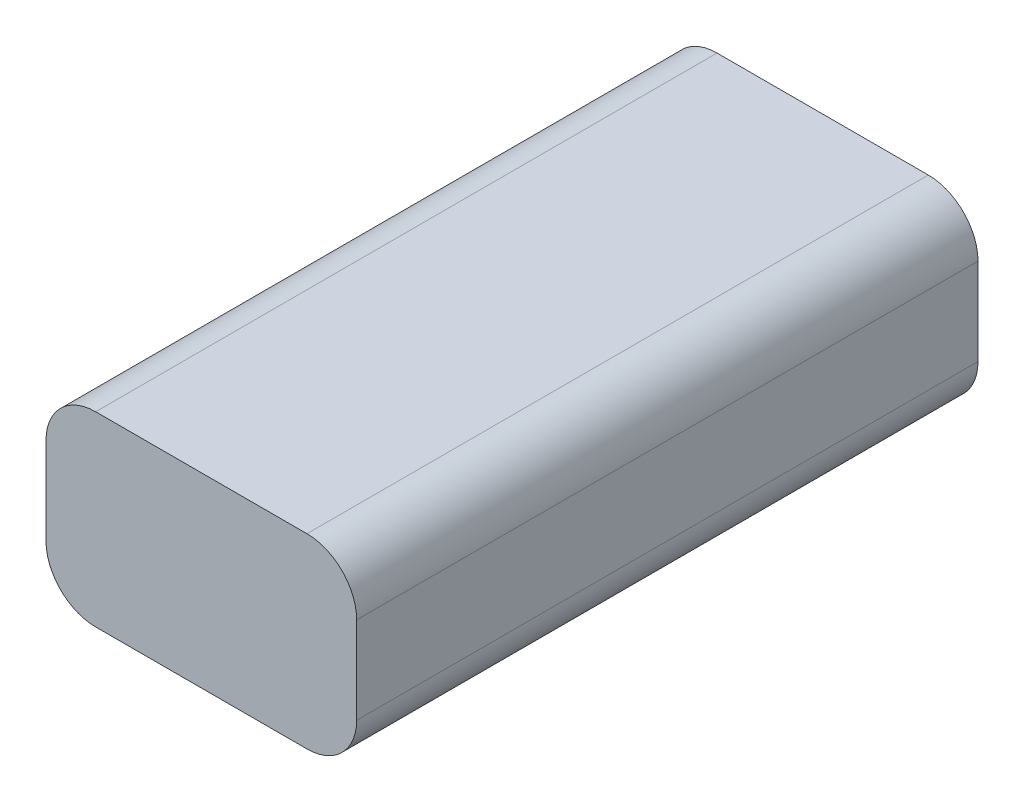
ISO-10303-21;
HEADER;
FILE_DESCRIPTION(('STEP AP214'),'2;1');
FILE_NAME('part.step','',(''),(''),'','','');
FILE_SCHEMA(('AUTOMOTIVE_DESIGN { 1 0 10303 214 1 1 1 1 }'));
ENDSEC;
DATA;
#1=APPLICATION_CONTEXT('core data for automotive mechanical design processes');
#2=APPLICATION_PROTOCOL_DEFINITION('international standard','automotive_design',2000,#1);
#3=PRODUCT_CONTEXT('',#1,'mechanical');
#4=PRODUCT('Part','Part','',(#3));
#5=PRODUCT_RELATED_PRODUCT_CATEGORY('part','',(#4));
#6=PRODUCT_DEFINITION_FORMATION('','',#4);
#7=PRODUCT_DEFINITION_CONTEXT('part definition',#1,'design');
#8=PRODUCT_DEFINITION('design','',#6,#7);
#9=PRODUCT_DEFINITION_SHAPE('','',#8);
#10=(LENGTH_UNIT() NAMED_UNIT(*) SI_UNIT(.MILLI.,.METRE.));
#11=(NAMED_UNIT(*) PLANE_ANGLE_UNIT() SI_UNIT($,.RADIAN.));
#12=(NAMED_UNIT(*) SI_UNIT($,.STERADIAN.) SOLID_ANGLE_UNIT());
#13=UNCERTAINTY_MEASURE_WITH_UNIT(LENGTH_MEASURE(1.E-05),#10,'distance_accuracy_value','');
#14=(GEOMETRIC_REPRESENTATION_CONTEXT(3) GLOBAL_UNCERTAINTY_ASSIGNED_CONTEXT((#13)) GLOBAL_UNIT_ASSIGNED_CONTEXT((#10,
#11,#12)) REPRESENTATION_CONTEXT('',''));
#15=CARTESIAN_POINT('',(0.,0.,0.));
#16=DIRECTION('',(0.,0.,1.));
#17=DIRECTION('',(1.,0.,0.));
#18=AXIS2_PLACEMENT_3D('',#15,#16,#17);
#19=CARTESIAN_POINT('',(25.,30.,-50.));
#20=DIRECTION('',(-1.,0.,0.));
#21=DIRECTION('',(0.,0.,1.));
#22=AXIS2_PLACEMENT_3D('',#19,#20,#21);
#23=PLANE('',#22);
#24=DIRECTION('',(0.,-1.,0.));
#25=VECTOR('',#24,1.);
#26=CARTESIAN_POINT('',(25.,30.,50.));
#27=LINE('',#26,#25);
#28=CARTESIAN_POINT('',(25.,22.,50.));
#29=VERTEX_POINT('',#28);
#30=CARTESIAN_POINT('',(25.,8.,50.));
#31=VERTEX_POINT('',#30);
#32=EDGE_CURVE('E123',#29,#31,#27,.T.);
#33=ORIENTED_EDGE('',*,*,#32,.T.);
#34=DIRECTION('',(0.,0.,-1.));
#35=VECTOR('',#34,1.);
#36=CARTESIAN_POINT('',(25.,8.,-50.));
#37=LINE('',#36,#35);
#38=CARTESIAN_POINT('',(25.,8.,-50.));
#39=VERTEX_POINT('',#38);
#40=EDGE_CURVE('E149',#31,#39,#37,.T.);
#41=ORIENTED_EDGE('',*,*,#40,.T.);
#42=DIRECTION('',(0.,-1.,0.));
#43=VECTOR('',#42,1.);
#44=CARTESIAN_POINT('',(25.,30.,-50.));
#45=LINE('',#44,#43);
#46=CARTESIAN_POINT('',(25.,22.,-50.));
#47=VERTEX_POINT('',#46);
#48=EDGE_CURVE('E127',#47,#39,#45,.T.);
#49=ORIENTED_EDGE('',*,*,#48,.F.);
#50=DIRECTION('',(0.,0.,-1.));
#51=VECTOR('',#50,1.);
#52=CARTESIAN_POINT('',(25.,22.,50.));
#53=LINE('',#52,#51);
#54=EDGE_CURVE('E147',#47,#29,#53,.F.);
#55=ORIENTED_EDGE('',*,*,#54,.T.);
#56=EDGE_LOOP('',(#33,#41,#49,#55));
#57=FACE_BOUND('',#56,.T.);
#58=ADVANCED_FACE('F35',(#57),#23,.F.);
#59=CARTESIAN_POINT('',(-25.,30.,-50.));
#60=DIRECTION('',(0.,0.,1.));
#61=DIRECTION('',(1.,0.,0.));
#62=AXIS2_PLACEMENT_3D('',#59,#60,#61);
#63=PLANE('',#62);
#64=DIRECTION('',(-1.,0.,0.));
#65=VECTOR('',#64,1.);
#66=CARTESIAN_POINT('',(-25.,0.,-50.));
#67=LINE('',#66,#65);
#68=CARTESIAN_POINT('',(17.,0.,-50.));
#69=VERTEX_POINT('',#68);
#70=CARTESIAN_POINT('',(-17.,0.,-50.));
#71=VERTEX_POINT('',#70);
#72=EDGE_CURVE('E159',#69,#71,#67,.T.);
#73=ORIENTED_EDGE('',*,*,#72,.T.);
#74=CARTESIAN_POINT('',(-17.,8.,-50.));
#75=DIRECTION('',(0.,0.,1.));
#76=DIRECTION('',(1.,0.,0.));
#77=AXIS2_PLACEMENT_3D('',#74,#75,#76);
#78=CIRCLE('',#77,8.);
#79=CARTESIAN_POINT('',(-25.,8.,-50.));
#80=VERTEX_POINT('',#79);
#81=EDGE_CURVE('E145',#71,#80,#78,.F.);
#82=ORIENTED_EDGE('',*,*,#81,.T.);
#83=DIRECTION('',(0.,-1.,0.));
#84=VECTOR('',#83,1.);
#85=CARTESIAN_POINT('',(-25.,30.,-50.));
#86=LINE('',#85,#84);
#87=CARTESIAN_POINT('',(-25.,22.,-50.));
#88=VERTEX_POINT('',#87);
#89=EDGE_CURVE('E122',#88,#80,#86,.T.);
#90=ORIENTED_EDGE('',*,*,#89,.F.);
#91=CARTESIAN_POINT('',(-17.,22.,-50.));
#92=DIRECTION('',(0.,0.,1.));
#93=DIRECTION('',(1.,0.,0.));
#94=AXIS2_PLACEMENT_3D('',#91,#92,#93);
#95=CIRCLE('',#94,8.);
#96=CARTESIAN_POINT('',(-17.,30.,-50.));
#97=VERTEX_POINT('',#96);
#98=EDGE_CURVE('E126',#88,#97,#95,.F.);
#99=ORIENTED_EDGE('',*,*,#98,.T.);
#100=DIRECTION('',(-1.,0.,0.));
#101=VECTOR('',#100,1.);
#102=CARTESIAN_POINT('',(-25.,30.,-50.));
#103=LINE('',#102,#101);
#104=CARTESIAN_POINT('',(17.,30.,-50.));
#105=VERTEX_POINT('',#104);
#106=EDGE_CURVE('E154',#105,#97,#103,.T.);
#107=ORIENTED_EDGE('',*,*,#106,.F.);
#108=CARTESIAN_POINT('',(17.,22.,-50.));
#109=DIRECTION('',(0.,0.,1.));
#110=DIRECTION('',(1.,0.,0.));
#111=AXIS2_PLACEMENT_3D('',#108,#109,#110);
#112=CIRCLE('',#111,8.);
#113=EDGE_CURVE('E58',#105,#47,#112,.F.);
#114=ORIENTED_EDGE('',*,*,#113,.T.);
#115=ORIENTED_EDGE('',*,*,#48,.T.);
#116=CARTESIAN_POINT('',(17.,8.,-50.));
#117=DIRECTION('',(0.,0.,1.));
#118=DIRECTION('',(1.,0.,0.));
#119=AXIS2_PLACEMENT_3D('',#116,#117,#118);
#120=CIRCLE('',#119,8.);
#121=EDGE_CURVE('E50',#39,#69,#120,.F.);
#122=ORIENTED_EDGE('',*,*,#121,.T.);
#123=EDGE_LOOP('',(#73,#82,#90,#99,#107,#114,#115,#122));
#124=FACE_BOUND('',#123,.T.);
#125=ADVANCED_FACE('F188',(#124),#63,.F.);
#126=CARTESIAN_POINT('',(-25.,30.,-50.));
#127=DIRECTION('',(1.,0.,0.));
#128=DIRECTION('',(0.,0.,-1.));
#129=AXIS2_PLACEMENT_3D('',#126,#127,#128);
#130=PLANE('',#129);
#131=ORIENTED_EDGE('',*,*,#89,.T.);
#132=DIRECTION('',(0.,0.,1.));
#133=VECTOR('',#132,1.);
#134=CARTESIAN_POINT('',(-25.,8.,-50.));
#135=LINE('',#134,#133);
#136=CARTESIAN_POINT('',(-25.,8.,50.));
#137=VERTEX_POINT('',#136);
#138=EDGE_CURVE('E113',#80,#137,#135,.T.);
#139=ORIENTED_EDGE('',*,*,#138,.T.);
#140=DIRECTION('',(0.,-1.,0.));
#141=VECTOR('',#140,1.);
#142=CARTESIAN_POINT('',(-25.,30.,50.));
#143=LINE('',#142,#141);
#144=CARTESIAN_POINT('',(-25.,22.,50.));
#145=VERTEX_POINT('',#144);
#146=EDGE_CURVE('E105',#145,#137,#143,.T.);
#147=ORIENTED_EDGE('',*,*,#146,.F.);
#148=DIRECTION('',(0.,0.,1.));
#149=VECTOR('',#148,1.);
#150=CARTESIAN_POINT('',(-25.,22.,-50.));
#151=LINE('',#150,#149);
#152=EDGE_CURVE('E119',#145,#88,#151,.F.);
#153=ORIENTED_EDGE('',*,*,#152,.T.);
#154=EDGE_LOOP('',(#131,#139,#147,#153));
#155=FACE_BOUND('',#154,.T.);
#156=ADVANCED_FACE('F118',(#155),#130,.F.);
#157=CARTESIAN_POINT('',(-25.,30.,50.));
#158=DIRECTION('',(0.,0.,-1.));
#159=DIRECTION('',(-1.,0.,0.));
#160=AXIS2_PLACEMENT_3D('',#157,#158,#159);
#161=PLANE('',#160);
#162=ORIENTED_EDGE('',*,*,#146,.T.);
#163=CARTESIAN_POINT('',(-17.,8.,50.));
#164=DIRECTION('',(0.,0.,-1.));
#165=DIRECTION('',(-1.,0.,0.));
#166=AXIS2_PLACEMENT_3D('',#163,#164,#165);
#167=CIRCLE('',#166,8.);
#168=CARTESIAN_POINT('',(-17.,0.,50.));
#169=VERTEX_POINT('',#168);
#170=EDGE_CURVE('E136',#137,#169,#167,.F.);
#171=ORIENTED_EDGE('',*,*,#170,.T.);
#172=DIRECTION('',(1.,0.,0.));
#173=VECTOR('',#172,1.);
#174=CARTESIAN_POINT('',(-25.,0.,50.));
#175=LINE('',#174,#173);
#176=CARTESIAN_POINT('',(17.,0.,50.));
#177=VERTEX_POINT('',#176);
#178=EDGE_CURVE('E155',#169,#177,#175,.T.);
#179=ORIENTED_EDGE('',*,*,#178,.T.);
#180=CARTESIAN_POINT('',(17.,8.,50.));
#181=DIRECTION('',(0.,0.,-1.));
#182=DIRECTION('',(-1.,0.,0.));
#183=AXIS2_PLACEMENT_3D('',#180,#181,#182);
#184=CIRCLE('',#183,8.);
#185=EDGE_CURVE('E134',#177,#31,#184,.F.);
#186=ORIENTED_EDGE('',*,*,#185,.T.);
#187=ORIENTED_EDGE('',*,*,#32,.F.);
#188=CARTESIAN_POINT('',(17.,22.,50.));
#189=DIRECTION('',(0.,0.,-1.));
#190=DIRECTION('',(-1.,0.,0.));
#191=AXIS2_PLACEMENT_3D('',#188,#189,#190);
#192=CIRCLE('',#191,8.);
#193=CARTESIAN_POINT('',(17.,30.,50.));
#194=VERTEX_POINT('',#193);
#195=EDGE_CURVE('E112',#29,#194,#192,.F.);
#196=ORIENTED_EDGE('',*,*,#195,.T.);
#197=DIRECTION('',(1.,0.,0.));
#198=VECTOR('',#197,1.);
#199=CARTESIAN_POINT('',(-25.,30.,50.));
#200=LINE('',#199,#198);
#201=CARTESIAN_POINT('',(-17.,30.,50.));
#202=VERTEX_POINT('',#201);
#203=EDGE_CURVE('E107',#202,#194,#200,.T.);
#204=ORIENTED_EDGE('',*,*,#203,.F.);
#205=CARTESIAN_POINT('',(-17.,22.,50.));
#206=DIRECTION('',(0.,0.,-1.));
#207=DIRECTION('',(-1.,0.,0.));
#208=AXIS2_PLACEMENT_3D('',#205,#206,#207);
#209=CIRCLE('',#208,8.);
#210=EDGE_CURVE('E102',#202,#145,#209,.F.);
#211=ORIENTED_EDGE('',*,*,#210,.T.);
#212=EDGE_LOOP('',(#162,#171,#179,#186,#187,#196,#204,#211));
#213=FACE_BOUND('',#212,.T.);
#214=ADVANCED_FACE('F104',(#213),#161,.F.);
#215=CARTESIAN_POINT('',(25.,30.,50.));
#216=DIRECTION('',(0.,1.,0.));
#217=DIRECTION('',(0.,0.,1.));
#218=AXIS2_PLACEMENT_3D('',#215,#216,#217);
#219=PLANE('',#218);
#220=ORIENTED_EDGE('',*,*,#203,.T.);
#221=DIRECTION('',(0.,0.,-1.));
#222=VECTOR('',#221,1.);
#223=CARTESIAN_POINT('',(17.,30.,-50.));
#224=LINE('',#223,#222);
#225=EDGE_CURVE('E11',#194,#105,#224,.T.);
#226=ORIENTED_EDGE('',*,*,#225,.T.);
#227=ORIENTED_EDGE('',*,*,#106,.T.);
#228=DIRECTION('',(0.,0.,1.));
#229=VECTOR('',#228,1.);
#230=CARTESIAN_POINT('',(-17.,30.,50.));
#231=LINE('',#230,#229);
#232=EDGE_CURVE('E43',#97,#202,#231,.T.);
#233=ORIENTED_EDGE('',*,*,#232,.T.);
#234=EDGE_LOOP('',(#220,#226,#227,#233));
#235=FACE_BOUND('',#234,.T.);
#236=ADVANCED_FACE('F152',(#235),#219,.T.);
#237=CARTESIAN_POINT('',(25.,0.,50.));
#238=DIRECTION('',(0.,1.,0.));
#239=DIRECTION('',(0.,0.,1.));
#240=AXIS2_PLACEMENT_3D('',#237,#238,#239);
#241=PLANE('',#240);
#242=ORIENTED_EDGE('',*,*,#178,.F.);
#243=DIRECTION('',(0.,0.,1.));
#244=VECTOR('',#243,1.);
#245=CARTESIAN_POINT('',(-17.,0.,50.));
#246=LINE('',#245,#244);
#247=EDGE_CURVE('E140',#169,#71,#246,.F.);
#248=ORIENTED_EDGE('',*,*,#247,.T.);
#249=ORIENTED_EDGE('',*,*,#72,.F.);
#250=DIRECTION('',(0.,0.,-1.));
#251=VECTOR('',#250,1.);
#252=CARTESIAN_POINT('',(17.,0.,50.));
#253=LINE('',#252,#251);
#254=EDGE_CURVE('E138',#69,#177,#253,.F.);
#255=ORIENTED_EDGE('',*,*,#254,.T.);
#256=EDGE_LOOP('',(#242,#248,#249,#255));
#257=FACE_BOUND('',#256,.T.);
#258=ADVANCED_FACE('F172',(#257),#241,.F.);
#259=CARTESIAN_POINT('',(-17.,8.,-50.));
#260=DIRECTION('',(0.,0.,1.));
#261=DIRECTION('',(1.,0.,0.));
#262=AXIS2_PLACEMENT_3D('',#259,#260,#261);
#263=CYLINDRICAL_SURFACE('',#262,8.);
#264=ORIENTED_EDGE('',*,*,#81,.F.);
#265=ORIENTED_EDGE('',*,*,#247,.F.);
#266=ORIENTED_EDGE('',*,*,#170,.F.);
#267=ORIENTED_EDGE('',*,*,#138,.F.);
#268=EDGE_LOOP('',(#264,#265,#266,#267));
#269=FACE_BOUND('',#268,.T.);
#270=ADVANCED_FACE('F167',(#269),#263,.T.);
#271=CARTESIAN_POINT('',(17.,8.,-50.));
#272=DIRECTION('',(0.,0.,-1.));
#273=DIRECTION('',(-1.,0.,0.));
#274=AXIS2_PLACEMENT_3D('',#271,#272,#273);
#275=CYLINDRICAL_SURFACE('',#274,8.);
#276=ORIENTED_EDGE('',*,*,#185,.F.);
#277=ORIENTED_EDGE('',*,*,#254,.F.);
#278=ORIENTED_EDGE('',*,*,#121,.F.);
#279=ORIENTED_EDGE('',*,*,#40,.F.);
#280=EDGE_LOOP('',(#276,#277,#278,#279));
#281=FACE_BOUND('',#280,.T.);
#282=ADVANCED_FACE('F174',(#281),#275,.T.);
#283=CARTESIAN_POINT('',(17.,22.,50.));
#284=DIRECTION('',(0.,0.,1.));
#285=DIRECTION('',(1.,0.,0.));
#286=AXIS2_PLACEMENT_3D('',#283,#284,#285);
#287=CYLINDRICAL_SURFACE('',#286,8.);
#288=ORIENTED_EDGE('',*,*,#195,.F.);
#289=ORIENTED_EDGE('',*,*,#54,.F.);
#290=ORIENTED_EDGE('',*,*,#113,.F.);
#291=ORIENTED_EDGE('',*,*,#225,.F.);
#292=EDGE_LOOP('',(#288,#289,#290,#291));
#293=FACE_BOUND('',#292,.T.);
#294=ADVANCED_FACE('F180',(#293),#287,.T.);
#295=CARTESIAN_POINT('',(-17.,22.,50.));
#296=DIRECTION('',(0.,0.,-1.));
#297=DIRECTION('',(-1.,0.,0.));
#298=AXIS2_PLACEMENT_3D('',#295,#296,#297);
#299=CYLINDRICAL_SURFACE('',#298,8.);
#300=ORIENTED_EDGE('',*,*,#98,.F.);
#301=ORIENTED_EDGE('',*,*,#152,.F.);
#302=ORIENTED_EDGE('',*,*,#210,.F.);
#303=ORIENTED_EDGE('',*,*,#232,.F.);
#304=EDGE_LOOP('',(#300,#301,#302,#303));
#305=FACE_BOUND('',#304,.T.);
#306=ADVANCED_FACE('F37',(#305),#299,.T.);
#307=CLOSED_SHELL('',(#58,#125,#156,#214,#236,#258,#270,#282,#294,#306));
#308=MANIFOLD_SOLID_BREP('B2',#307);
#309=ADVANCED_BREP_SHAPE_REPRESENTATION('',(#18,#308),#14);
#310=SHAPE_DEFINITION_REPRESENTATION(#9,#309);
ENDSEC;
END-ISO-10303-21;
